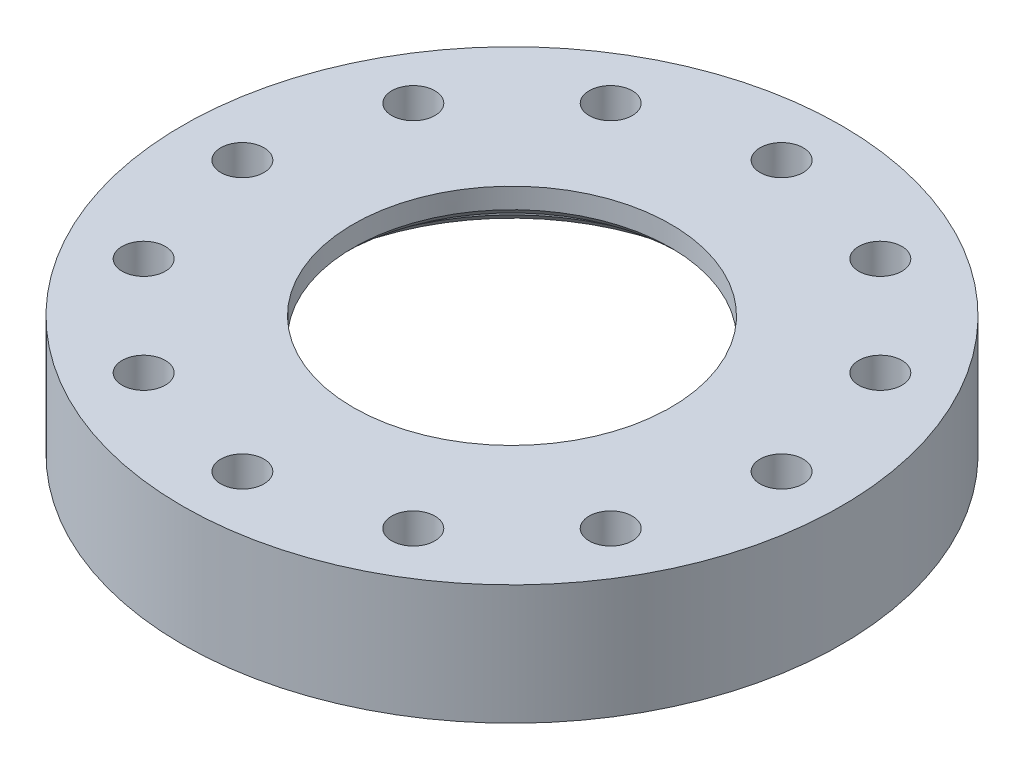
ISO-10303-21;
HEADER;
FILE_DESCRIPTION(('STEP AP214'),'2;1');
FILE_NAME('part.step','',(''),(''),'','','');
FILE_SCHEMA(('AUTOMOTIVE_DESIGN { 1 0 10303 214 1 1 1 1 }'));
ENDSEC;
DATA;
#1=APPLICATION_CONTEXT('core data for automotive mechanical design processes');
#2=APPLICATION_PROTOCOL_DEFINITION('international standard','automotive_design',2000,#1);
#3=PRODUCT_CONTEXT('',#1,'mechanical');
#4=PRODUCT('Part','Part','',(#3));
#5=PRODUCT_RELATED_PRODUCT_CATEGORY('part','',(#4));
#6=PRODUCT_DEFINITION_FORMATION('','',#4);
#7=PRODUCT_DEFINITION_CONTEXT('part definition',#1,'design');
#8=PRODUCT_DEFINITION('design','',#6,#7);
#9=PRODUCT_DEFINITION_SHAPE('','',#8);
#10=(LENGTH_UNIT() NAMED_UNIT(*) SI_UNIT(.MILLI.,.METRE.));
#11=(NAMED_UNIT(*) PLANE_ANGLE_UNIT() SI_UNIT($,.RADIAN.));
#12=(NAMED_UNIT(*) SI_UNIT($,.STERADIAN.) SOLID_ANGLE_UNIT());
#13=UNCERTAINTY_MEASURE_WITH_UNIT(LENGTH_MEASURE(1.E-05),#10,'distance_accuracy_value','');
#14=(GEOMETRIC_REPRESENTATION_CONTEXT(3) GLOBAL_UNCERTAINTY_ASSIGNED_CONTEXT((#13)) GLOBAL_UNIT_ASSIGNED_CONTEXT((#10,
#11,#12)) REPRESENTATION_CONTEXT('',''));
#15=CARTESIAN_POINT('',(0.,0.,0.));
#16=DIRECTION('',(0.,0.,1.));
#17=DIRECTION('',(1.,0.,0.));
#18=AXIS2_PLACEMENT_3D('',#15,#16,#17);
#19=CARTESIAN_POINT('',(0.,0.,0.));
#20=DIRECTION('',(0.,1.,0.));
#21=DIRECTION('',(0.,0.,1.));
#22=AXIS2_PLACEMENT_3D('',#19,#20,#21);
#23=CYLINDRICAL_SURFACE('',#22,25.75);
#24=CARTESIAN_POINT('',(0.,7.,0.));
#25=DIRECTION('',(0.,1.,0.));
#26=DIRECTION('',(0.,0.,1.));
#27=AXIS2_PLACEMENT_3D('',#24,#25,#26);
#28=CIRCLE('',#27,25.75);
#29=CARTESIAN_POINT('',(0.,7.,25.75));
#30=VERTEX_POINT('',#29);
#31=EDGE_CURVE('E122',#30,#30,#28,.T.);
#32=ORIENTED_EDGE('',*,*,#31,.T.);
#33=EDGE_LOOP('',(#32));
#34=FACE_BOUND('',#33,.T.);
#35=CARTESIAN_POINT('',(0.,0.,0.));
#36=DIRECTION('',(0.,1.,0.));
#37=DIRECTION('',(0.,0.,1.));
#38=AXIS2_PLACEMENT_3D('',#35,#36,#37);
#39=CIRCLE('',#38,25.75);
#40=CARTESIAN_POINT('',(0.,0.,25.75));
#41=VERTEX_POINT('',#40);
#42=EDGE_CURVE('E56',#41,#41,#39,.T.);
#43=ORIENTED_EDGE('',*,*,#42,.F.);
#44=EDGE_LOOP('',(#43));
#45=FACE_BOUND('',#44,.T.);
#46=ADVANCED_FACE('F35',(#34,#45),#23,.F.);
#47=CARTESIAN_POINT('',(-25.75,0.,0.));
#48=DIRECTION('',(0.,-1.,0.));
#49=DIRECTION('',(0.,0.,-1.));
#50=AXIS2_PLACEMENT_3D('',#47,#48,#49);
#51=PLANE('',#50);
#52=ORIENTED_EDGE('',*,*,#42,.T.);
#53=EDGE_LOOP('',(#52));
#54=FACE_BOUND('',#53,.T.);
#55=CARTESIAN_POINT('',(0.,0.,0.));
#56=DIRECTION('',(0.,1.,0.));
#57=DIRECTION('',(0.,0.,1.));
#58=AXIS2_PLACEMENT_3D('',#55,#56,#57);
#59=CIRCLE('',#58,27.5);
#60=CARTESIAN_POINT('',(0.,0.,27.5));
#61=VERTEX_POINT('',#60);
#62=EDGE_CURVE('E104',#61,#61,#59,.T.);
#63=ORIENTED_EDGE('',*,*,#62,.F.);
#64=EDGE_LOOP('',(#63));
#65=FACE_BOUND('',#64,.T.);
#66=ADVANCED_FACE('F198',(#54,#65),#51,.T.);
#67=CARTESIAN_POINT('',(0.,0.,0.));
#68=DIRECTION('',(0.,1.,0.));
#69=DIRECTION('',(0.,0.,1.));
#70=AXIS2_PLACEMENT_3D('',#67,#68,#69);
#71=CYLINDRICAL_SURFACE('',#70,27.5);
#72=ORIENTED_EDGE('',*,*,#62,.T.);
#73=EDGE_LOOP('',(#72));
#74=FACE_BOUND('',#73,.T.);
#75=CARTESIAN_POINT('',(0.,10.,0.));
#76=DIRECTION('',(0.,1.,0.));
#77=DIRECTION('',(0.,0.,1.));
#78=AXIS2_PLACEMENT_3D('',#75,#76,#77);
#79=CIRCLE('',#78,27.5);
#80=CARTESIAN_POINT('',(0.,10.,27.5));
#81=VERTEX_POINT('',#80);
#82=EDGE_CURVE('E107',#81,#81,#79,.T.);
#83=ORIENTED_EDGE('',*,*,#82,.F.);
#84=EDGE_LOOP('',(#83));
#85=FACE_BOUND('',#84,.T.);
#86=ADVANCED_FACE('F159',(#74,#85),#71,.T.);
#87=CARTESIAN_POINT('',(-27.5,10.,0.));
#88=DIRECTION('',(0.,1.,0.));
#89=DIRECTION('',(0.,0.,1.));
#90=AXIS2_PLACEMENT_3D('',#87,#88,#89);
#91=PLANE('',#90);
#92=CARTESIAN_POINT('',(-22.5,10.,0.));
#93=DIRECTION('',(0.,1.,0.));
#94=DIRECTION('',(0.,0.,1.));
#95=AXIS2_PLACEMENT_3D('',#92,#93,#94);
#96=CIRCLE('',#95,1.8);
#97=CARTESIAN_POINT('',(-22.5,10.,1.8));
#98=VERTEX_POINT('',#97);
#99=EDGE_CURVE('E61',#98,#98,#96,.T.);
#100=ORIENTED_EDGE('',*,*,#99,.F.);
#101=EDGE_LOOP('',(#100));
#102=FACE_BOUND('',#101,.T.);
#103=CARTESIAN_POINT('',(-19.4855715851499,10.,-11.25));
#104=DIRECTION('',(0.,1.,0.));
#105=DIRECTION('',(0.,0.,1.));
#106=AXIS2_PLACEMENT_3D('',#103,#104,#105);
#107=CIRCLE('',#106,1.8);
#108=CARTESIAN_POINT('',(-19.4855715851499,10.,-9.45000000000002));
#109=VERTEX_POINT('',#108);
#110=EDGE_CURVE('E60',#109,#109,#107,.T.);
#111=ORIENTED_EDGE('',*,*,#110,.F.);
#112=EDGE_LOOP('',(#111));
#113=FACE_BOUND('',#112,.T.);
#114=CARTESIAN_POINT('',(-11.25,10.,-19.4855715851499));
#115=DIRECTION('',(0.,1.,0.));
#116=DIRECTION('',(0.,0.,1.));
#117=AXIS2_PLACEMENT_3D('',#114,#115,#116);
#118=CIRCLE('',#117,1.8);
#119=CARTESIAN_POINT('',(-11.25,10.,-17.6855715851499));
#120=VERTEX_POINT('',#119);
#121=EDGE_CURVE('E65',#120,#120,#118,.T.);
#122=ORIENTED_EDGE('',*,*,#121,.F.);
#123=EDGE_LOOP('',(#122));
#124=FACE_BOUND('',#123,.T.);
#125=CARTESIAN_POINT('',(0.,10.,-22.5));
#126=DIRECTION('',(0.,1.,0.));
#127=DIRECTION('',(0.,0.,1.));
#128=AXIS2_PLACEMENT_3D('',#125,#126,#127);
#129=CIRCLE('',#128,1.8);
#130=CARTESIAN_POINT('',(0.,10.,-20.7));
#131=VERTEX_POINT('',#130);
#132=EDGE_CURVE('E69',#131,#131,#129,.T.);
#133=ORIENTED_EDGE('',*,*,#132,.F.);
#134=EDGE_LOOP('',(#133));
#135=FACE_BOUND('',#134,.T.);
#136=CARTESIAN_POINT('',(11.2500000000001,10.,-19.4855715851498));
#137=DIRECTION('',(0.,1.,0.));
#138=DIRECTION('',(0.,0.,1.));
#139=AXIS2_PLACEMENT_3D('',#136,#137,#138);
#140=CIRCLE('',#139,1.8);
#141=CARTESIAN_POINT('',(11.2500000000001,10.,-17.6855715851498));
#142=VERTEX_POINT('',#141);
#143=EDGE_CURVE('E73',#142,#142,#140,.T.);
#144=ORIENTED_EDGE('',*,*,#143,.F.);
#145=EDGE_LOOP('',(#144));
#146=FACE_BOUND('',#145,.T.);
#147=CARTESIAN_POINT('',(19.4855715851499,10.,-11.2499999999999));
#148=DIRECTION('',(0.,1.,0.));
#149=DIRECTION('',(0.,0.,1.));
#150=AXIS2_PLACEMENT_3D('',#147,#148,#149);
#151=CIRCLE('',#150,1.8);
#152=CARTESIAN_POINT('',(19.4855715851499,10.,-9.44999999999988));
#153=VERTEX_POINT('',#152);
#154=EDGE_CURVE('E77',#153,#153,#151,.T.);
#155=ORIENTED_EDGE('',*,*,#154,.F.);
#156=EDGE_LOOP('',(#155));
#157=FACE_BOUND('',#156,.T.);
#158=CARTESIAN_POINT('',(22.5,10.,1.57116660247941E-13));
#159=DIRECTION('',(0.,1.,0.));
#160=DIRECTION('',(0.,0.,1.));
#161=AXIS2_PLACEMENT_3D('',#158,#159,#160);
#162=CIRCLE('',#161,1.8);
#163=CARTESIAN_POINT('',(22.5,10.,1.80000000000016));
#164=VERTEX_POINT('',#163);
#165=EDGE_CURVE('E81',#164,#164,#162,.T.);
#166=ORIENTED_EDGE('',*,*,#165,.F.);
#167=EDGE_LOOP('',(#166));
#168=FACE_BOUND('',#167,.T.);
#169=CARTESIAN_POINT('',(19.4855715851498,10.,11.2500000000002));
#170=DIRECTION('',(0.,1.,0.));
#171=DIRECTION('',(0.,0.,1.));
#172=AXIS2_PLACEMENT_3D('',#169,#170,#171);
#173=CIRCLE('',#172,1.8);
#174=CARTESIAN_POINT('',(19.4855715851498,10.,13.0500000000002));
#175=VERTEX_POINT('',#174);
#176=EDGE_CURVE('E85',#175,#175,#173,.T.);
#177=ORIENTED_EDGE('',*,*,#176,.F.);
#178=EDGE_LOOP('',(#177));
#179=FACE_BOUND('',#178,.T.);
#180=CARTESIAN_POINT('',(11.2499999999998,10.,19.48557158515));
#181=DIRECTION('',(0.,1.,0.));
#182=DIRECTION('',(0.,0.,1.));
#183=AXIS2_PLACEMENT_3D('',#180,#181,#182);
#184=CIRCLE('',#183,1.8);
#185=CARTESIAN_POINT('',(11.2499999999998,10.,21.28557158515));
#186=VERTEX_POINT('',#185);
#187=EDGE_CURVE('E89',#186,#186,#184,.T.);
#188=ORIENTED_EDGE('',*,*,#187,.F.);
#189=EDGE_LOOP('',(#188));
#190=FACE_BOUND('',#189,.T.);
#191=CARTESIAN_POINT('',(-2.35674990371912E-13,10.,22.5));
#192=DIRECTION('',(0.,1.,0.));
#193=DIRECTION('',(0.,0.,1.));
#194=AXIS2_PLACEMENT_3D('',#191,#192,#193);
#195=CIRCLE('',#194,1.8);
#196=CARTESIAN_POINT('',(-2.35674990371912E-13,10.,24.3));
#197=VERTEX_POINT('',#196);
#198=EDGE_CURVE('E93',#197,#197,#195,.T.);
#199=ORIENTED_EDGE('',*,*,#198,.F.);
#200=EDGE_LOOP('',(#199));
#201=FACE_BOUND('',#200,.T.);
#202=CARTESIAN_POINT('',(-11.2500000000002,10.,19.4855715851497));
#203=DIRECTION('',(0.,1.,0.));
#204=DIRECTION('',(0.,0.,1.));
#205=AXIS2_PLACEMENT_3D('',#202,#203,#204);
#206=CIRCLE('',#205,1.8);
#207=CARTESIAN_POINT('',(-11.2500000000002,10.,21.2855715851497));
#208=VERTEX_POINT('',#207);
#209=EDGE_CURVE('E97',#208,#208,#206,.T.);
#210=ORIENTED_EDGE('',*,*,#209,.F.);
#211=EDGE_LOOP('',(#210));
#212=FACE_BOUND('',#211,.T.);
#213=CARTESIAN_POINT('',(-19.48557158515,10.,11.2499999999997));
#214=DIRECTION('',(0.,1.,0.));
#215=DIRECTION('',(0.,0.,1.));
#216=AXIS2_PLACEMENT_3D('',#213,#214,#215);
#217=CIRCLE('',#216,1.8);
#218=CARTESIAN_POINT('',(-19.48557158515,10.,13.0499999999997));
#219=VERTEX_POINT('',#218);
#220=EDGE_CURVE('E101',#219,#219,#217,.T.);
#221=ORIENTED_EDGE('',*,*,#220,.F.);
#222=EDGE_LOOP('',(#221));
#223=FACE_BOUND('',#222,.T.);
#224=ORIENTED_EDGE('',*,*,#82,.T.);
#225=EDGE_LOOP('',(#224));
#226=FACE_BOUND('',#225,.T.);
#227=CARTESIAN_POINT('',(0.,10.,0.));
#228=DIRECTION('',(0.,1.,0.));
#229=DIRECTION('',(0.,0.,1.));
#230=AXIS2_PLACEMENT_3D('',#227,#228,#229);
#231=CIRCLE('',#230,13.25);
#232=CARTESIAN_POINT('',(0.,10.,13.25));
#233=VERTEX_POINT('',#232);
#234=EDGE_CURVE('E110',#233,#233,#231,.T.);
#235=ORIENTED_EDGE('',*,*,#234,.F.);
#236=EDGE_LOOP('',(#235));
#237=FACE_BOUND('',#236,.T.);
#238=ADVANCED_FACE('F155',(#102,#113,#124,#135,#146,#157,#168,#179,#190,#201,#212,#223,#226,
#237),#91,.T.);
#239=CARTESIAN_POINT('',(0.,0.,0.));
#240=DIRECTION('',(0.,1.,0.));
#241=DIRECTION('',(0.,0.,1.));
#242=AXIS2_PLACEMENT_3D('',#239,#240,#241);
#243=CYLINDRICAL_SURFACE('',#242,13.25);
#244=CARTESIAN_POINT('',(0.,8.30000000000001,0.));
#245=DIRECTION('',(0.,-1.,0.));
#246=DIRECTION('',(0.,0.,-1.));
#247=AXIS2_PLACEMENT_3D('',#244,#245,#246);
#248=CIRCLE('',#247,13.25);
#249=CARTESIAN_POINT('',(0.,8.30000000000001,-13.25));
#250=VERTEX_POINT('',#249);
#251=EDGE_CURVE('E47',#250,#250,#248,.T.);
#252=ORIENTED_EDGE('',*,*,#251,.T.);
#253=EDGE_LOOP('',(#252));
#254=FACE_BOUND('',#253,.T.);
#255=ORIENTED_EDGE('',*,*,#234,.T.);
#256=EDGE_LOOP('',(#255));
#257=FACE_BOUND('',#256,.T.);
#258=ADVANCED_FACE('F158',(#254,#257),#243,.F.);
#259=CARTESIAN_POINT('',(-16.25,7.5,0.));
#260=DIRECTION('',(0.,-1.,0.));
#261=DIRECTION('',(0.,0.,-1.));
#262=AXIS2_PLACEMENT_3D('',#259,#260,#261);
#263=PLANE('',#262);
#264=CARTESIAN_POINT('',(0.,7.5,0.));
#265=DIRECTION('',(0.,-1.,0.));
#266=DIRECTION('',(0.,0.,-1.));
#267=AXIS2_PLACEMENT_3D('',#264,#265,#266);
#268=CIRCLE('',#267,14.05);
#269=CARTESIAN_POINT('',(0.,7.5,-14.05));
#270=VERTEX_POINT('',#269);
#271=EDGE_CURVE('E51',#270,#270,#268,.F.);
#272=ORIENTED_EDGE('',*,*,#271,.T.);
#273=EDGE_LOOP('',(#272));
#274=FACE_BOUND('',#273,.T.);
#275=CARTESIAN_POINT('',(0.,7.5,0.));
#276=DIRECTION('',(0.,1.,0.));
#277=DIRECTION('',(0.,0.,1.));
#278=AXIS2_PLACEMENT_3D('',#275,#276,#277);
#279=CIRCLE('',#278,16.25);
#280=CARTESIAN_POINT('',(0.,7.5,16.25));
#281=VERTEX_POINT('',#280);
#282=EDGE_CURVE('E113',#281,#281,#279,.T.);
#283=ORIENTED_EDGE('',*,*,#282,.F.);
#284=EDGE_LOOP('',(#283));
#285=FACE_BOUND('',#284,.T.);
#286=ADVANCED_FACE('F188',(#274,#285),#263,.T.);
#287=CARTESIAN_POINT('',(0.,0.,0.));
#288=DIRECTION('',(0.,1.,0.));
#289=DIRECTION('',(0.,0.,1.));
#290=AXIS2_PLACEMENT_3D('',#287,#288,#289);
#291=CYLINDRICAL_SURFACE('',#290,16.25);
#292=CARTESIAN_POINT('',(0.,5.8,0.));
#293=DIRECTION('',(0.,-1.,0.));
#294=DIRECTION('',(0.,0.,-1.));
#295=AXIS2_PLACEMENT_3D('',#292,#293,#294);
#296=CIRCLE('',#295,16.25);
#297=CARTESIAN_POINT('',(0.,5.8,-16.25));
#298=VERTEX_POINT('',#297);
#299=EDGE_CURVE('E10',#298,#298,#296,.T.);
#300=ORIENTED_EDGE('',*,*,#299,.T.);
#301=EDGE_LOOP('',(#300));
#302=FACE_BOUND('',#301,.T.);
#303=ORIENTED_EDGE('',*,*,#282,.T.);
#304=EDGE_LOOP('',(#303));
#305=FACE_BOUND('',#304,.T.);
#306=ADVANCED_FACE('F194',(#302,#305),#291,.F.);
#307=CARTESIAN_POINT('',(-16.25,5.,0.));
#308=DIRECTION('',(0.,-1.,0.));
#309=DIRECTION('',(0.,0.,-1.));
#310=AXIS2_PLACEMENT_3D('',#307,#308,#309);
#311=PLANE('',#310);
#312=CARTESIAN_POINT('',(0.,5.,0.));
#313=DIRECTION('',(0.,-1.,0.));
#314=DIRECTION('',(0.,0.,-1.));
#315=AXIS2_PLACEMENT_3D('',#312,#313,#314);
#316=CIRCLE('',#315,17.05);
#317=CARTESIAN_POINT('',(0.,5.,-17.05));
#318=VERTEX_POINT('',#317);
#319=EDGE_CURVE('E43',#318,#318,#316,.F.);
#320=ORIENTED_EDGE('',*,*,#319,.T.);
#321=EDGE_LOOP('',(#320));
#322=FACE_BOUND('',#321,.T.);
#323=CARTESIAN_POINT('',(0.,5.,0.));
#324=DIRECTION('',(0.,1.,0.));
#325=DIRECTION('',(0.,0.,1.));
#326=AXIS2_PLACEMENT_3D('',#323,#324,#325);
#327=CIRCLE('',#326,19.25);
#328=CARTESIAN_POINT('',(0.,5.,19.25));
#329=VERTEX_POINT('',#328);
#330=EDGE_CURVE('E116',#329,#329,#327,.T.);
#331=ORIENTED_EDGE('',*,*,#330,.F.);
#332=EDGE_LOOP('',(#331));
#333=FACE_BOUND('',#332,.T.);
#334=ADVANCED_FACE('F229',(#322,#333),#311,.T.);
#335=CARTESIAN_POINT('',(0.,0.,0.));
#336=DIRECTION('',(0.,1.,0.));
#337=DIRECTION('',(0.,0.,1.));
#338=AXIS2_PLACEMENT_3D('',#335,#336,#337);
#339=CYLINDRICAL_SURFACE('',#338,19.25);
#340=ORIENTED_EDGE('',*,*,#330,.T.);
#341=EDGE_LOOP('',(#340));
#342=FACE_BOUND('',#341,.T.);
#343=CARTESIAN_POINT('',(0.,7.,0.));
#344=DIRECTION('',(0.,1.,0.));
#345=DIRECTION('',(0.,0.,1.));
#346=AXIS2_PLACEMENT_3D('',#343,#344,#345);
#347=CIRCLE('',#346,19.25);
#348=CARTESIAN_POINT('',(0.,7.,19.25));
#349=VERTEX_POINT('',#348);
#350=EDGE_CURVE('E119',#349,#349,#347,.T.);
#351=ORIENTED_EDGE('',*,*,#350,.F.);
#352=EDGE_LOOP('',(#351));
#353=FACE_BOUND('',#352,.T.);
#354=ADVANCED_FACE('F234',(#342,#353),#339,.T.);
#355=CARTESIAN_POINT('',(-19.25,7.,0.));
#356=DIRECTION('',(0.,-1.,0.));
#357=DIRECTION('',(0.,0.,-1.));
#358=AXIS2_PLACEMENT_3D('',#355,#356,#357);
#359=PLANE('',#358);
#360=CARTESIAN_POINT('',(-22.5,7.,0.));
#361=DIRECTION('',(0.,-1.,0.));
#362=DIRECTION('',(0.,0.,-1.));
#363=AXIS2_PLACEMENT_3D('',#360,#361,#362);
#364=CIRCLE('',#363,1.8);
#365=CARTESIAN_POINT('',(-22.5,7.,-1.8));
#366=VERTEX_POINT('',#365);
#367=EDGE_CURVE('E57',#366,#366,#364,.T.);
#368=ORIENTED_EDGE('',*,*,#367,.F.);
#369=EDGE_LOOP('',(#368));
#370=FACE_BOUND('',#369,.T.);
#371=CARTESIAN_POINT('',(-19.4855715851499,7.,-11.25));
#372=DIRECTION('',(0.,-1.,0.));
#373=DIRECTION('',(0.,0.,-1.));
#374=AXIS2_PLACEMENT_3D('',#371,#372,#373);
#375=CIRCLE('',#374,1.8);
#376=CARTESIAN_POINT('',(-19.4855715851499,7.,-13.05));
#377=VERTEX_POINT('',#376);
#378=EDGE_CURVE('E62',#377,#377,#375,.T.);
#379=ORIENTED_EDGE('',*,*,#378,.F.);
#380=EDGE_LOOP('',(#379));
#381=FACE_BOUND('',#380,.T.);
#382=CARTESIAN_POINT('',(-11.25,7.,-19.4855715851499));
#383=DIRECTION('',(0.,-1.,0.));
#384=DIRECTION('',(0.,0.,-1.));
#385=AXIS2_PLACEMENT_3D('',#382,#383,#384);
#386=CIRCLE('',#385,1.8);
#387=CARTESIAN_POINT('',(-11.25,7.,-21.2855715851499));
#388=VERTEX_POINT('',#387);
#389=EDGE_CURVE('E66',#388,#388,#386,.T.);
#390=ORIENTED_EDGE('',*,*,#389,.F.);
#391=EDGE_LOOP('',(#390));
#392=FACE_BOUND('',#391,.T.);
#393=CARTESIAN_POINT('',(0.,7.,-22.5));
#394=DIRECTION('',(0.,-1.,0.));
#395=DIRECTION('',(0.,0.,-1.));
#396=AXIS2_PLACEMENT_3D('',#393,#394,#395);
#397=CIRCLE('',#396,1.8);
#398=CARTESIAN_POINT('',(0.,7.,-24.3));
#399=VERTEX_POINT('',#398);
#400=EDGE_CURVE('E70',#399,#399,#397,.T.);
#401=ORIENTED_EDGE('',*,*,#400,.F.);
#402=EDGE_LOOP('',(#401));
#403=FACE_BOUND('',#402,.T.);
#404=CARTESIAN_POINT('',(11.2500000000001,7.,-19.4855715851498));
#405=DIRECTION('',(0.,-1.,0.));
#406=DIRECTION('',(0.,0.,-1.));
#407=AXIS2_PLACEMENT_3D('',#404,#405,#406);
#408=CIRCLE('',#407,1.8);
#409=CARTESIAN_POINT('',(11.2500000000001,7.,-21.2855715851498));
#410=VERTEX_POINT('',#409);
#411=EDGE_CURVE('E74',#410,#410,#408,.T.);
#412=ORIENTED_EDGE('',*,*,#411,.F.);
#413=EDGE_LOOP('',(#412));
#414=FACE_BOUND('',#413,.T.);
#415=CARTESIAN_POINT('',(19.4855715851499,7.,-11.2499999999999));
#416=DIRECTION('',(0.,-1.,0.));
#417=DIRECTION('',(0.,0.,-1.));
#418=AXIS2_PLACEMENT_3D('',#415,#416,#417);
#419=CIRCLE('',#418,1.8);
#420=CARTESIAN_POINT('',(19.4855715851499,7.,-13.0499999999999));
#421=VERTEX_POINT('',#420);
#422=EDGE_CURVE('E78',#421,#421,#419,.T.);
#423=ORIENTED_EDGE('',*,*,#422,.F.);
#424=EDGE_LOOP('',(#423));
#425=FACE_BOUND('',#424,.T.);
#426=CARTESIAN_POINT('',(22.5,7.,1.57116660247941E-13));
#427=DIRECTION('',(0.,-1.,0.));
#428=DIRECTION('',(0.,0.,-1.));
#429=AXIS2_PLACEMENT_3D('',#426,#427,#428);
#430=CIRCLE('',#429,1.8);
#431=CARTESIAN_POINT('',(22.5,7.,-1.79999999999984));
#432=VERTEX_POINT('',#431);
#433=EDGE_CURVE('E82',#432,#432,#430,.T.);
#434=ORIENTED_EDGE('',*,*,#433,.F.);
#435=EDGE_LOOP('',(#434));
#436=FACE_BOUND('',#435,.T.);
#437=CARTESIAN_POINT('',(19.4855715851498,7.,11.2500000000002));
#438=DIRECTION('',(0.,-1.,0.));
#439=DIRECTION('',(0.,0.,-1.));
#440=AXIS2_PLACEMENT_3D('',#437,#438,#439);
#441=CIRCLE('',#440,1.8);
#442=CARTESIAN_POINT('',(19.4855715851498,7.,9.45000000000016));
#443=VERTEX_POINT('',#442);
#444=EDGE_CURVE('E86',#443,#443,#441,.T.);
#445=ORIENTED_EDGE('',*,*,#444,.F.);
#446=EDGE_LOOP('',(#445));
#447=FACE_BOUND('',#446,.T.);
#448=CARTESIAN_POINT('',(11.2499999999998,7.,19.48557158515));
#449=DIRECTION('',(0.,-1.,0.));
#450=DIRECTION('',(0.,0.,-1.));
#451=AXIS2_PLACEMENT_3D('',#448,#449,#450);
#452=CIRCLE('',#451,1.8);
#453=CARTESIAN_POINT('',(11.2499999999998,7.,17.68557158515));
#454=VERTEX_POINT('',#453);
#455=EDGE_CURVE('E90',#454,#454,#452,.T.);
#456=ORIENTED_EDGE('',*,*,#455,.F.);
#457=EDGE_LOOP('',(#456));
#458=FACE_BOUND('',#457,.T.);
#459=CARTESIAN_POINT('',(-2.35674990371912E-13,7.,22.5));
#460=DIRECTION('',(0.,-1.,0.));
#461=DIRECTION('',(0.,0.,-1.));
#462=AXIS2_PLACEMENT_3D('',#459,#460,#461);
#463=CIRCLE('',#462,1.8);
#464=CARTESIAN_POINT('',(-2.35674990371912E-13,7.,20.7));
#465=VERTEX_POINT('',#464);
#466=EDGE_CURVE('E94',#465,#465,#463,.T.);
#467=ORIENTED_EDGE('',*,*,#466,.F.);
#468=EDGE_LOOP('',(#467));
#469=FACE_BOUND('',#468,.T.);
#470=CARTESIAN_POINT('',(-11.2500000000002,7.,19.4855715851497));
#471=DIRECTION('',(0.,-1.,0.));
#472=DIRECTION('',(0.,0.,-1.));
#473=AXIS2_PLACEMENT_3D('',#470,#471,#472);
#474=CIRCLE('',#473,1.8);
#475=CARTESIAN_POINT('',(-11.2500000000002,7.,17.6855715851497));
#476=VERTEX_POINT('',#475);
#477=EDGE_CURVE('E98',#476,#476,#474,.T.);
#478=ORIENTED_EDGE('',*,*,#477,.F.);
#479=EDGE_LOOP('',(#478));
#480=FACE_BOUND('',#479,.T.);
#481=CARTESIAN_POINT('',(-19.48557158515,7.,11.2499999999997));
#482=DIRECTION('',(0.,-1.,0.));
#483=DIRECTION('',(0.,0.,-1.));
#484=AXIS2_PLACEMENT_3D('',#481,#482,#483);
#485=CIRCLE('',#484,1.8);
#486=CARTESIAN_POINT('',(-19.48557158515,7.,9.44999999999975));
#487=VERTEX_POINT('',#486);
#488=EDGE_CURVE('E125',#487,#487,#485,.T.);
#489=ORIENTED_EDGE('',*,*,#488,.F.);
#490=EDGE_LOOP('',(#489));
#491=FACE_BOUND('',#490,.T.);
#492=ORIENTED_EDGE('',*,*,#350,.T.);
#493=EDGE_LOOP('',(#492));
#494=FACE_BOUND('',#493,.T.);
#495=ORIENTED_EDGE('',*,*,#31,.F.);
#496=EDGE_LOOP('',(#495));
#497=FACE_BOUND('',#496,.T.);
#498=ADVANCED_FACE('F239',(#370,#381,#392,#403,#414,#425,#436,#447,#458,#469,#480,#491,#494,
#497),#359,.T.);
#499=CARTESIAN_POINT('',(-19.48557158515,10.,11.2499999999997));
#500=DIRECTION('',(0.,1.,0.));
#501=DIRECTION('',(0.,0.,1.));
#502=AXIS2_PLACEMENT_3D('',#499,#500,#501);
#503=CYLINDRICAL_SURFACE('',#502,1.8);
#504=ORIENTED_EDGE('',*,*,#488,.T.);
#505=EDGE_LOOP('',(#504));
#506=FACE_BOUND('',#505,.T.);
#507=ORIENTED_EDGE('',*,*,#220,.T.);
#508=EDGE_LOOP('',(#507));
#509=FACE_BOUND('',#508,.T.);
#510=ADVANCED_FACE('F243',(#506,#509),#503,.F.);
#511=CARTESIAN_POINT('',(-11.2500000000002,10.,19.4855715851497));
#512=DIRECTION('',(0.,1.,0.));
#513=DIRECTION('',(0.,0.,1.));
#514=AXIS2_PLACEMENT_3D('',#511,#512,#513);
#515=CYLINDRICAL_SURFACE('',#514,1.8);
#516=ORIENTED_EDGE('',*,*,#477,.T.);
#517=EDGE_LOOP('',(#516));
#518=FACE_BOUND('',#517,.T.);
#519=ORIENTED_EDGE('',*,*,#209,.T.);
#520=EDGE_LOOP('',(#519));
#521=FACE_BOUND('',#520,.T.);
#522=ADVANCED_FACE('F247',(#518,#521),#515,.F.);
#523=CARTESIAN_POINT('',(-2.35674990371912E-13,10.,22.5));
#524=DIRECTION('',(0.,1.,0.));
#525=DIRECTION('',(0.,0.,1.));
#526=AXIS2_PLACEMENT_3D('',#523,#524,#525);
#527=CYLINDRICAL_SURFACE('',#526,1.8);
#528=ORIENTED_EDGE('',*,*,#466,.T.);
#529=EDGE_LOOP('',(#528));
#530=FACE_BOUND('',#529,.T.);
#531=ORIENTED_EDGE('',*,*,#198,.T.);
#532=EDGE_LOOP('',(#531));
#533=FACE_BOUND('',#532,.T.);
#534=ADVANCED_FACE('F251',(#530,#533),#527,.F.);
#535=CARTESIAN_POINT('',(11.2499999999998,10.,19.48557158515));
#536=DIRECTION('',(0.,1.,0.));
#537=DIRECTION('',(0.,0.,1.));
#538=AXIS2_PLACEMENT_3D('',#535,#536,#537);
#539=CYLINDRICAL_SURFACE('',#538,1.8);
#540=ORIENTED_EDGE('',*,*,#455,.T.);
#541=EDGE_LOOP('',(#540));
#542=FACE_BOUND('',#541,.T.);
#543=ORIENTED_EDGE('',*,*,#187,.T.);
#544=EDGE_LOOP('',(#543));
#545=FACE_BOUND('',#544,.T.);
#546=ADVANCED_FACE('F255',(#542,#545),#539,.F.);
#547=CARTESIAN_POINT('',(19.4855715851498,10.,11.2500000000002));
#548=DIRECTION('',(0.,1.,0.));
#549=DIRECTION('',(0.,0.,1.));
#550=AXIS2_PLACEMENT_3D('',#547,#548,#549);
#551=CYLINDRICAL_SURFACE('',#550,1.8);
#552=ORIENTED_EDGE('',*,*,#444,.T.);
#553=EDGE_LOOP('',(#552));
#554=FACE_BOUND('',#553,.T.);
#555=ORIENTED_EDGE('',*,*,#176,.T.);
#556=EDGE_LOOP('',(#555));
#557=FACE_BOUND('',#556,.T.);
#558=ADVANCED_FACE('F259',(#554,#557),#551,.F.);
#559=CARTESIAN_POINT('',(22.5,10.,1.57116660247941E-13));
#560=DIRECTION('',(0.,1.,0.));
#561=DIRECTION('',(0.,0.,1.));
#562=AXIS2_PLACEMENT_3D('',#559,#560,#561);
#563=CYLINDRICAL_SURFACE('',#562,1.8);
#564=ORIENTED_EDGE('',*,*,#433,.T.);
#565=EDGE_LOOP('',(#564));
#566=FACE_BOUND('',#565,.T.);
#567=ORIENTED_EDGE('',*,*,#165,.T.);
#568=EDGE_LOOP('',(#567));
#569=FACE_BOUND('',#568,.T.);
#570=ADVANCED_FACE('F263',(#566,#569),#563,.F.);
#571=CARTESIAN_POINT('',(19.4855715851499,10.,-11.2499999999999));
#572=DIRECTION('',(0.,1.,0.));
#573=DIRECTION('',(0.,0.,1.));
#574=AXIS2_PLACEMENT_3D('',#571,#572,#573);
#575=CYLINDRICAL_SURFACE('',#574,1.8);
#576=ORIENTED_EDGE('',*,*,#422,.T.);
#577=EDGE_LOOP('',(#576));
#578=FACE_BOUND('',#577,.T.);
#579=ORIENTED_EDGE('',*,*,#154,.T.);
#580=EDGE_LOOP('',(#579));
#581=FACE_BOUND('',#580,.T.);
#582=ADVANCED_FACE('F267',(#578,#581),#575,.F.);
#583=CARTESIAN_POINT('',(11.2500000000001,10.,-19.4855715851498));
#584=DIRECTION('',(0.,1.,0.));
#585=DIRECTION('',(0.,0.,1.));
#586=AXIS2_PLACEMENT_3D('',#583,#584,#585);
#587=CYLINDRICAL_SURFACE('',#586,1.8);
#588=ORIENTED_EDGE('',*,*,#411,.T.);
#589=EDGE_LOOP('',(#588));
#590=FACE_BOUND('',#589,.T.);
#591=ORIENTED_EDGE('',*,*,#143,.T.);
#592=EDGE_LOOP('',(#591));
#593=FACE_BOUND('',#592,.T.);
#594=ADVANCED_FACE('F271',(#590,#593),#587,.F.);
#595=CARTESIAN_POINT('',(0.,10.,-22.5));
#596=DIRECTION('',(0.,1.,0.));
#597=DIRECTION('',(0.,0.,1.));
#598=AXIS2_PLACEMENT_3D('',#595,#596,#597);
#599=CYLINDRICAL_SURFACE('',#598,1.8);
#600=ORIENTED_EDGE('',*,*,#400,.T.);
#601=EDGE_LOOP('',(#600));
#602=FACE_BOUND('',#601,.T.);
#603=ORIENTED_EDGE('',*,*,#132,.T.);
#604=EDGE_LOOP('',(#603));
#605=FACE_BOUND('',#604,.T.);
#606=ADVANCED_FACE('F275',(#602,#605),#599,.F.);
#607=CARTESIAN_POINT('',(-11.25,10.,-19.4855715851499));
#608=DIRECTION('',(0.,1.,0.));
#609=DIRECTION('',(0.,0.,1.));
#610=AXIS2_PLACEMENT_3D('',#607,#608,#609);
#611=CYLINDRICAL_SURFACE('',#610,1.8);
#612=ORIENTED_EDGE('',*,*,#389,.T.);
#613=EDGE_LOOP('',(#612));
#614=FACE_BOUND('',#613,.T.);
#615=ORIENTED_EDGE('',*,*,#121,.T.);
#616=EDGE_LOOP('',(#615));
#617=FACE_BOUND('',#616,.T.);
#618=ADVANCED_FACE('F279',(#614,#617),#611,.F.);
#619=CARTESIAN_POINT('',(-19.4855715851499,10.,-11.25));
#620=DIRECTION('',(0.,1.,0.));
#621=DIRECTION('',(0.,0.,1.));
#622=AXIS2_PLACEMENT_3D('',#619,#620,#621);
#623=CYLINDRICAL_SURFACE('',#622,1.8);
#624=ORIENTED_EDGE('',*,*,#378,.T.);
#625=EDGE_LOOP('',(#624));
#626=FACE_BOUND('',#625,.T.);
#627=ORIENTED_EDGE('',*,*,#110,.T.);
#628=EDGE_LOOP('',(#627));
#629=FACE_BOUND('',#628,.T.);
#630=ADVANCED_FACE('F219',(#626,#629),#623,.F.);
#631=CARTESIAN_POINT('',(-22.5,10.,0.));
#632=DIRECTION('',(0.,1.,0.));
#633=DIRECTION('',(0.,0.,1.));
#634=AXIS2_PLACEMENT_3D('',#631,#632,#633);
#635=CYLINDRICAL_SURFACE('',#634,1.8);
#636=ORIENTED_EDGE('',*,*,#367,.T.);
#637=EDGE_LOOP('',(#636));
#638=FACE_BOUND('',#637,.T.);
#639=ORIENTED_EDGE('',*,*,#99,.T.);
#640=EDGE_LOOP('',(#639));
#641=FACE_BOUND('',#640,.T.);
#642=ADVANCED_FACE('F153',(#638,#641),#635,.F.);
#643=CARTESIAN_POINT('',(0.,7.5,0.));
#644=DIRECTION('',(0.,-1.,0.));
#645=DIRECTION('',(0.,0.,-1.));
#646=AXIS2_PLACEMENT_3D('',#643,#644,#645);
#647=CONICAL_SURFACE('',#646,14.05,0.785398163397445);
#648=ORIENTED_EDGE('',*,*,#251,.F.);
#649=EDGE_LOOP('',(#648));
#650=FACE_BOUND('',#649,.T.);
#651=ORIENTED_EDGE('',*,*,#271,.F.);
#652=EDGE_LOOP('',(#651));
#653=FACE_BOUND('',#652,.T.);
#654=ADVANCED_FACE('F209',(#650,#653),#647,.F.);
#655=CARTESIAN_POINT('',(0.,5.,0.));
#656=DIRECTION('',(0.,-1.,0.));
#657=DIRECTION('',(0.,0.,-1.));
#658=AXIS2_PLACEMENT_3D('',#655,#656,#657);
#659=CONICAL_SURFACE('',#658,17.05,0.785398163397446);
#660=CARTESIAN_POINT('',(0.,5.8,-16.25));
#661=CARTESIAN_POINT('',(0.,5.79166666666667,-16.2583333333333));
#662=CARTESIAN_POINT('',(0.,5.78333333333333,-16.2666666666667));
#663=CARTESIAN_POINT('',(0.,5.76666666666667,-16.2833333333333));
#664=CARTESIAN_POINT('',(0.,5.75833333333333,-16.2916666666667));
#665=CARTESIAN_POINT('',(0.,5.74166666666667,-16.3083333333333));
#666=CARTESIAN_POINT('',(0.,5.73333333333333,-16.3166666666667));
#667=CARTESIAN_POINT('',(0.,5.71666666666667,-16.3333333333333));
#668=CARTESIAN_POINT('',(0.,5.70833333333333,-16.3416666666667));
#669=CARTESIAN_POINT('',(0.,5.69166666666667,-16.3583333333333));
#670=CARTESIAN_POINT('',(0.,5.68333333333333,-16.3666666666667));
#671=CARTESIAN_POINT('',(0.,5.66666666666667,-16.3833333333333));
#672=CARTESIAN_POINT('',(0.,5.65833333333333,-16.3916666666667));
#673=CARTESIAN_POINT('',(0.,5.64166666666667,-16.4083333333333));
#674=CARTESIAN_POINT('',(0.,5.63333333333333,-16.4166666666667));
#675=CARTESIAN_POINT('',(0.,5.61666666666667,-16.4333333333333));
#676=CARTESIAN_POINT('',(0.,5.60833333333333,-16.4416666666667));
#677=CARTESIAN_POINT('',(0.,5.59166666666667,-16.4583333333333));
#678=CARTESIAN_POINT('',(0.,5.58333333333333,-16.4666666666667));
#679=CARTESIAN_POINT('',(0.,5.56666666666667,-16.4833333333333));
#680=CARTESIAN_POINT('',(0.,5.55833333333333,-16.4916666666667));
#681=CARTESIAN_POINT('',(0.,5.54166666666667,-16.5083333333333));
#682=CARTESIAN_POINT('',(0.,5.53333333333333,-16.5166666666667));
#683=CARTESIAN_POINT('',(0.,5.51666666666667,-16.5333333333333));
#684=CARTESIAN_POINT('',(0.,5.50833333333333,-16.5416666666667));
#685=CARTESIAN_POINT('',(0.,5.49166666666667,-16.5583333333333));
#686=CARTESIAN_POINT('',(0.,5.48333333333333,-16.5666666666667));
#687=CARTESIAN_POINT('',(0.,5.46666666666667,-16.5833333333333));
#688=CARTESIAN_POINT('',(0.,5.45833333333333,-16.5916666666667));
#689=CARTESIAN_POINT('',(0.,5.44166666666667,-16.6083333333333));
#690=CARTESIAN_POINT('',(0.,5.43333333333333,-16.6166666666667));
#691=CARTESIAN_POINT('',(0.,5.41666666666667,-16.6333333333333));
#692=CARTESIAN_POINT('',(0.,5.40833333333333,-16.6416666666667));
#693=CARTESIAN_POINT('',(0.,5.39166666666667,-16.6583333333333));
#694=CARTESIAN_POINT('',(0.,5.38333333333333,-16.6666666666667));
#695=CARTESIAN_POINT('',(0.,5.36666666666667,-16.6833333333333));
#696=CARTESIAN_POINT('',(0.,5.35833333333333,-16.6916666666667));
#697=CARTESIAN_POINT('',(0.,5.34166666666667,-16.7083333333333));
#698=CARTESIAN_POINT('',(0.,5.33333333333333,-16.7166666666667));
#699=CARTESIAN_POINT('',(0.,5.31666666666667,-16.7333333333333));
#700=CARTESIAN_POINT('',(0.,5.30833333333333,-16.7416666666667));
#701=CARTESIAN_POINT('',(0.,5.29166666666667,-16.7583333333333));
#702=CARTESIAN_POINT('',(0.,5.28333333333333,-16.7666666666667));
#703=CARTESIAN_POINT('',(0.,5.26666666666667,-16.7833333333333));
#704=CARTESIAN_POINT('',(0.,5.25833333333333,-16.7916666666667));
#705=CARTESIAN_POINT('',(0.,5.24166666666667,-16.8083333333333));
#706=CARTESIAN_POINT('',(0.,5.23333333333333,-16.8166666666667));
#707=CARTESIAN_POINT('',(0.,5.21666666666667,-16.8333333333333));
#708=CARTESIAN_POINT('',(0.,5.20833333333333,-16.8416666666667));
#709=CARTESIAN_POINT('',(0.,5.19166666666667,-16.8583333333333));
#710=CARTESIAN_POINT('',(0.,5.18333333333333,-16.8666666666667));
#711=CARTESIAN_POINT('',(0.,5.16666666666667,-16.8833333333333));
#712=CARTESIAN_POINT('',(0.,5.15833333333333,-16.8916666666667));
#713=CARTESIAN_POINT('',(0.,5.14166666666667,-16.9083333333333));
#714=CARTESIAN_POINT('',(0.,5.13333333333333,-16.9166666666667));
#715=CARTESIAN_POINT('',(0.,5.11666666666667,-16.9333333333333));
#716=CARTESIAN_POINT('',(0.,5.10833333333333,-16.9416666666667));
#717=CARTESIAN_POINT('',(0.,5.09166666666667,-16.9583333333333));
#718=CARTESIAN_POINT('',(0.,5.08333333333333,-16.9666666666667));
#719=CARTESIAN_POINT('',(0.,5.06666666666667,-16.9833333333333));
#720=CARTESIAN_POINT('',(0.,5.05833333333333,-16.9916666666667));
#721=CARTESIAN_POINT('',(0.,5.04166666666667,-17.0083333333333));
#722=CARTESIAN_POINT('',(0.,5.03333333333333,-17.0166666666667));
#723=CARTESIAN_POINT('',(0.,5.01666666666667,-17.0333333333333));
#724=CARTESIAN_POINT('',(0.,5.00833333333334,-17.0416666666667));
#725=CARTESIAN_POINT('',(0.,5.,-17.05));
#726=B_SPLINE_CURVE_WITH_KNOTS('',3,(#660,#661,#662,#663,#664,#665,#666,#667,#668,#669,#670,
#671,#672,#673,#674,#675,#676,#677,#678,#679,#680,#681,#682,#683,#684,#685,#686,#687,#688,#689,
#690,#691,#692,#693,#694,#695,#696,#697,#698,#699,#700,#701,#702,#703,#704,#705,#706,#707,#708,
#709,#710,#711,#712,#713,#714,#715,#716,#717,#718,#719,#720,#721,#722,#723,#724,#725),
.UNSPECIFIED.,.F.,.F.,(4,2,2,2,2,2,2,2,2,2,2,2,2,2,2,2,2,2,2,2,2,2,2,2,2,2,2,2,2,2,2,2,4),(0.,
0.0353553390593278,0.0707106781186537,0.106066017177981,0.141421356237309,0.176776695296637,
0.212132034355962,0.24748737341529,0.282842712474618,0.318198051533946,0.353553390593272,
0.388908729652599,0.424264068711927,0.459619407771255,0.49497474683058,0.530330085889908,
0.565685424949236,0.601040764008564,0.63639610306789,0.671751442127217,0.707106781186545,
0.742462120245873,0.777817459305198,0.813172798364526,0.848528137423854,0.883883476483182,
0.919238815542507,0.954594154601835,0.989949493661163,1.02530483272049,1.06066017177982,
1.09601551083914,1.13137084989847),.UNSPECIFIED.);
#727=EDGE_CURVE('BSEAM38',#298,#318,#726,.T.);
#728=ORIENTED_EDGE('',*,*,#299,.F.);
#729=ORIENTED_EDGE('',*,*,#319,.F.);
#730=ORIENTED_EDGE('',*,*,#727,.T.);
#731=ORIENTED_EDGE('',*,*,#727,.F.);
#732=EDGE_LOOP('',(#728,#730,#729,#731));
#733=FACE_BOUND('',#732,.T.);
#734=ADVANCED_FACE('F38',(#733),#659,.F.);
#735=CLOSED_SHELL('',(#46,#66,#86,#238,#258,#286,#306,#334,#354,#498,#510,#522,#534,#546,#558,
#570,#582,#594,#606,#618,#630,#642,#654,#734));
#736=MANIFOLD_SOLID_BREP('B2',#735);
#737=ADVANCED_BREP_SHAPE_REPRESENTATION('',(#18,#736),#14);
#738=SHAPE_DEFINITION_REPRESENTATION(#9,#737);
ENDSEC;
END-ISO-10303-21;
